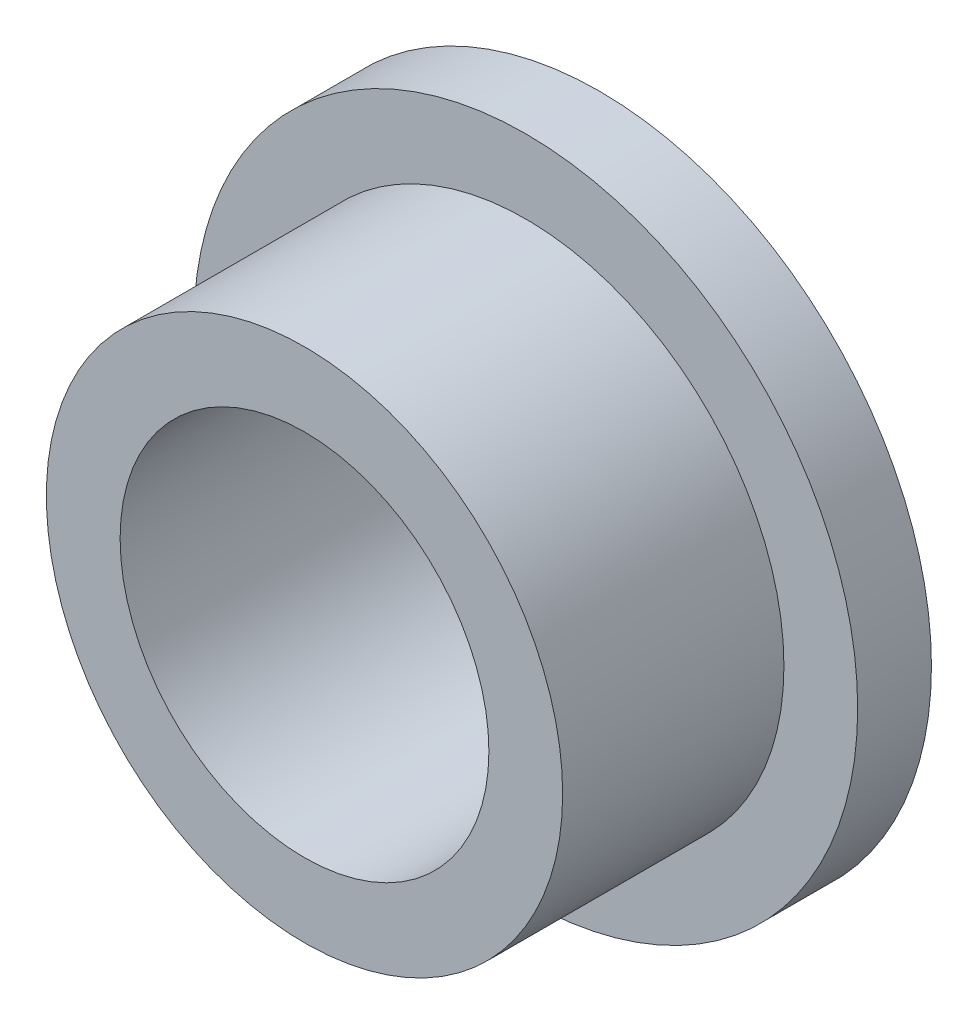
ISO-10303-21;
HEADER;
FILE_DESCRIPTION(('STEP AP214'),'2;1');
FILE_NAME('part.step','',(''),(''),'','','');
FILE_SCHEMA(('AUTOMOTIVE_DESIGN { 1 0 10303 214 1 1 1 1 }'));
ENDSEC;
DATA;
#1=APPLICATION_CONTEXT('core data for automotive mechanical design processes');
#2=APPLICATION_PROTOCOL_DEFINITION('international standard','automotive_design',2000,#1);
#3=PRODUCT_CONTEXT('',#1,'mechanical');
#4=PRODUCT('Part','Part','',(#3));
#5=PRODUCT_RELATED_PRODUCT_CATEGORY('part','',(#4));
#6=PRODUCT_DEFINITION_FORMATION('','',#4);
#7=PRODUCT_DEFINITION_CONTEXT('part definition',#1,'design');
#8=PRODUCT_DEFINITION('design','',#6,#7);
#9=PRODUCT_DEFINITION_SHAPE('','',#8);
#10=(LENGTH_UNIT() NAMED_UNIT(*) SI_UNIT(.MILLI.,.METRE.));
#11=(NAMED_UNIT(*) PLANE_ANGLE_UNIT() SI_UNIT($,.RADIAN.));
#12=(NAMED_UNIT(*) SI_UNIT($,.STERADIAN.) SOLID_ANGLE_UNIT());
#13=UNCERTAINTY_MEASURE_WITH_UNIT(LENGTH_MEASURE(1.E-05),#10,'distance_accuracy_value','');
#14=(GEOMETRIC_REPRESENTATION_CONTEXT(3) GLOBAL_UNCERTAINTY_ASSIGNED_CONTEXT((#13)) GLOBAL_UNIT_ASSIGNED_CONTEXT((#10,
#11,#12)) REPRESENTATION_CONTEXT('',''));
#15=CARTESIAN_POINT('',(0.,0.,0.));
#16=DIRECTION('',(0.,0.,1.));
#17=DIRECTION('',(1.,0.,0.));
#18=AXIS2_PLACEMENT_3D('',#15,#16,#17);
#19=CARTESIAN_POINT('',(0.,0.,6.35));
#20=DIRECTION('',(0.,0.,1.));
#21=DIRECTION('',(1.,0.,0.));
#22=AXIS2_PLACEMENT_3D('',#19,#20,#21);
#23=PLANE('',#22);
#24=CARTESIAN_POINT('',(0.,0.,6.35));
#25=DIRECTION('',(0.,0.,1.));
#26=DIRECTION('',(1.,0.,0.));
#27=AXIS2_PLACEMENT_3D('',#24,#25,#26);
#28=CIRCLE('',#27,3.96875);
#29=CARTESIAN_POINT('',(3.96875,0.,6.35));
#30=VERTEX_POINT('',#29);
#31=EDGE_CURVE('E37',#30,#30,#28,.T.);
#32=ORIENTED_EDGE('',*,*,#31,.F.);
#33=EDGE_LOOP('',(#32));
#34=FACE_BOUND('',#33,.T.);
#35=CARTESIAN_POINT('',(0.,0.,6.35));
#36=DIRECTION('',(0.,0.,1.));
#37=DIRECTION('',(1.,0.,0.));
#38=AXIS2_PLACEMENT_3D('',#35,#36,#37);
#39=CIRCLE('',#38,5.55625);
#40=CARTESIAN_POINT('',(5.55625,0.,6.35));
#41=VERTEX_POINT('',#40);
#42=EDGE_CURVE('E51',#41,#41,#39,.T.);
#43=ORIENTED_EDGE('',*,*,#42,.T.);
#44=EDGE_LOOP('',(#43));
#45=FACE_BOUND('',#44,.T.);
#46=ADVANCED_FACE('F30',(#34,#45),#23,.T.);
#47=CARTESIAN_POINT('',(0.,0.,6.35));
#48=DIRECTION('',(0.,0.,-1.));
#49=DIRECTION('',(-1.,0.,0.));
#50=AXIS2_PLACEMENT_3D('',#47,#48,#49);
#51=CYLINDRICAL_SURFACE('',#50,7.14375);
#52=CARTESIAN_POINT('',(0.,0.,0.));
#53=DIRECTION('',(0.,0.,1.));
#54=DIRECTION('',(1.,0.,0.));
#55=AXIS2_PLACEMENT_3D('',#52,#53,#54);
#56=CIRCLE('',#55,7.14375);
#57=CARTESIAN_POINT('',(7.14375,0.,0.));
#58=VERTEX_POINT('',#57);
#59=EDGE_CURVE('E10',#58,#58,#56,.T.);
#60=ORIENTED_EDGE('',*,*,#59,.T.);
#61=EDGE_LOOP('',(#60));
#62=FACE_BOUND('',#61,.T.);
#63=CARTESIAN_POINT('',(0.,0.,1.5875));
#64=DIRECTION('',(0.,0.,1.));
#65=DIRECTION('',(1.,0.,0.));
#66=AXIS2_PLACEMENT_3D('',#63,#64,#65);
#67=CIRCLE('',#66,7.14375);
#68=CARTESIAN_POINT('',(7.14375,0.,1.5875));
#69=VERTEX_POINT('',#68);
#70=EDGE_CURVE('E46',#69,#69,#67,.T.);
#71=ORIENTED_EDGE('',*,*,#70,.F.);
#72=EDGE_LOOP('',(#71));
#73=FACE_BOUND('',#72,.T.);
#74=ADVANCED_FACE('F32',(#62,#73),#51,.T.);
#75=CARTESIAN_POINT('',(0.,0.,0.));
#76=DIRECTION('',(0.,0.,1.));
#77=DIRECTION('',(1.,0.,0.));
#78=AXIS2_PLACEMENT_3D('',#75,#76,#77);
#79=PLANE('',#78);
#80=ORIENTED_EDGE('',*,*,#59,.F.);
#81=EDGE_LOOP('',(#80));
#82=FACE_BOUND('',#81,.T.);
#83=CARTESIAN_POINT('',(0.,0.,0.));
#84=DIRECTION('',(0.,0.,1.));
#85=DIRECTION('',(1.,0.,0.));
#86=AXIS2_PLACEMENT_3D('',#83,#84,#85);
#87=CIRCLE('',#86,3.96875);
#88=CARTESIAN_POINT('',(3.96875,0.,0.));
#89=VERTEX_POINT('',#88);
#90=EDGE_CURVE('E41',#89,#89,#87,.T.);
#91=ORIENTED_EDGE('',*,*,#90,.T.);
#92=EDGE_LOOP('',(#91));
#93=FACE_BOUND('',#92,.T.);
#94=ADVANCED_FACE('F68',(#82,#93),#79,.F.);
#95=CARTESIAN_POINT('',(0.,0.,6.35));
#96=DIRECTION('',(0.,0.,-1.));
#97=DIRECTION('',(-1.,0.,0.));
#98=AXIS2_PLACEMENT_3D('',#95,#96,#97);
#99=CYLINDRICAL_SURFACE('',#98,3.96875);
#100=ORIENTED_EDGE('',*,*,#31,.T.);
#101=EDGE_LOOP('',(#100));
#102=FACE_BOUND('',#101,.T.);
#103=ORIENTED_EDGE('',*,*,#90,.F.);
#104=EDGE_LOOP('',(#103));
#105=FACE_BOUND('',#104,.T.);
#106=ADVANCED_FACE('F63',(#102,#105),#99,.F.);
#107=CARTESIAN_POINT('',(0.,0.,1.5875));
#108=DIRECTION('',(0.,0.,1.));
#109=DIRECTION('',(1.,0.,0.));
#110=AXIS2_PLACEMENT_3D('',#107,#108,#109);
#111=PLANE('',#110);
#112=CARTESIAN_POINT('',(0.,0.,1.5875));
#113=DIRECTION('',(0.,0.,1.));
#114=DIRECTION('',(1.,0.,0.));
#115=AXIS2_PLACEMENT_3D('',#112,#113,#114);
#116=CIRCLE('',#115,5.55625);
#117=CARTESIAN_POINT('',(5.55625,0.,1.5875));
#118=VERTEX_POINT('',#117);
#119=EDGE_CURVE('E50',#118,#118,#116,.T.);
#120=ORIENTED_EDGE('',*,*,#119,.F.);
#121=EDGE_LOOP('',(#120));
#122=FACE_BOUND('',#121,.T.);
#123=ORIENTED_EDGE('',*,*,#70,.T.);
#124=EDGE_LOOP('',(#123));
#125=FACE_BOUND('',#124,.T.);
#126=ADVANCED_FACE('F60',(#122,#125),#111,.T.);
#127=CARTESIAN_POINT('',(0.,0.,1.5875));
#128=DIRECTION('',(0.,0.,1.));
#129=DIRECTION('',(1.,0.,0.));
#130=AXIS2_PLACEMENT_3D('',#127,#128,#129);
#131=CYLINDRICAL_SURFACE('',#130,5.55625);
#132=CARTESIAN_POINT('',(5.55625,0.,1.5875));
#133=CARTESIAN_POINT('',(5.55625,0.,1.637109375));
#134=CARTESIAN_POINT('',(5.55625,0.,1.68671875));
#135=CARTESIAN_POINT('',(5.55625,0.,1.7859375));
#136=CARTESIAN_POINT('',(5.55625,0.,1.835546875));
#137=CARTESIAN_POINT('',(5.55625,0.,1.934765625));
#138=CARTESIAN_POINT('',(5.55625,0.,1.984375));
#139=CARTESIAN_POINT('',(5.55625,0.,2.08359375));
#140=CARTESIAN_POINT('',(5.55625,0.,2.133203125));
#141=CARTESIAN_POINT('',(5.55625,0.,2.232421875));
#142=CARTESIAN_POINT('',(5.55625,0.,2.28203125));
#143=CARTESIAN_POINT('',(5.55625,0.,2.38125));
#144=CARTESIAN_POINT('',(5.55625,0.,2.430859375));
#145=CARTESIAN_POINT('',(5.55625,0.,2.530078125));
#146=CARTESIAN_POINT('',(5.55625,0.,2.5796875));
#147=CARTESIAN_POINT('',(5.55625,0.,2.67890625));
#148=CARTESIAN_POINT('',(5.55625,0.,2.728515625));
#149=CARTESIAN_POINT('',(5.55625,0.,2.827734375));
#150=CARTESIAN_POINT('',(5.55625,0.,2.87734375));
#151=CARTESIAN_POINT('',(5.55625,0.,2.9765625));
#152=CARTESIAN_POINT('',(5.55625,0.,3.026171875));
#153=CARTESIAN_POINT('',(5.55625,0.,3.125390625));
#154=CARTESIAN_POINT('',(5.55625,0.,3.175));
#155=CARTESIAN_POINT('',(5.55625,0.,3.27421875));
#156=CARTESIAN_POINT('',(5.55625,0.,3.323828125));
#157=CARTESIAN_POINT('',(5.55625,0.,3.423046875));
#158=CARTESIAN_POINT('',(5.55625,0.,3.47265625));
#159=CARTESIAN_POINT('',(5.55625,0.,3.571875));
#160=CARTESIAN_POINT('',(5.55625,0.,3.621484375));
#161=CARTESIAN_POINT('',(5.55625,0.,3.720703125));
#162=CARTESIAN_POINT('',(5.55625,0.,3.7703125));
#163=CARTESIAN_POINT('',(5.55625,0.,3.86953125));
#164=CARTESIAN_POINT('',(5.55625,0.,3.919140625));
#165=CARTESIAN_POINT('',(5.55625,0.,4.018359375));
#166=CARTESIAN_POINT('',(5.55625,0.,4.06796875));
#167=CARTESIAN_POINT('',(5.55625,0.,4.1671875));
#168=CARTESIAN_POINT('',(5.55625,0.,4.216796875));
#169=CARTESIAN_POINT('',(5.55625,0.,4.316015625));
#170=CARTESIAN_POINT('',(5.55625,0.,4.365625));
#171=CARTESIAN_POINT('',(5.55625,0.,4.46484375));
#172=CARTESIAN_POINT('',(5.55625,0.,4.514453125));
#173=CARTESIAN_POINT('',(5.55625,0.,4.613671875));
#174=CARTESIAN_POINT('',(5.55625,0.,4.66328125));
#175=CARTESIAN_POINT('',(5.55625,0.,4.7625));
#176=CARTESIAN_POINT('',(5.55625,0.,4.812109375));
#177=CARTESIAN_POINT('',(5.55625,0.,4.911328125));
#178=CARTESIAN_POINT('',(5.55625,0.,4.9609375));
#179=CARTESIAN_POINT('',(5.55625,0.,5.06015625));
#180=CARTESIAN_POINT('',(5.55625,0.,5.109765625));
#181=CARTESIAN_POINT('',(5.55625,0.,5.208984375));
#182=CARTESIAN_POINT('',(5.55625,0.,5.25859375));
#183=CARTESIAN_POINT('',(5.55625,0.,5.3578125));
#184=CARTESIAN_POINT('',(5.55625,0.,5.407421875));
#185=CARTESIAN_POINT('',(5.55625,0.,5.506640625));
#186=CARTESIAN_POINT('',(5.55625,0.,5.55625));
#187=CARTESIAN_POINT('',(5.55625,0.,5.65546875));
#188=CARTESIAN_POINT('',(5.55625,0.,5.705078125));
#189=CARTESIAN_POINT('',(5.55625,0.,5.804296875));
#190=CARTESIAN_POINT('',(5.55625,0.,5.85390625));
#191=CARTESIAN_POINT('',(5.55625,0.,5.953125));
#192=CARTESIAN_POINT('',(5.55625,0.,6.002734375));
#193=CARTESIAN_POINT('',(5.55625,0.,6.101953125));
#194=CARTESIAN_POINT('',(5.55625,0.,6.1515625));
#195=CARTESIAN_POINT('',(5.55625,0.,6.25078125));
#196=CARTESIAN_POINT('',(5.55625,0.,6.300390625));
#197=CARTESIAN_POINT('',(5.55625,0.,6.35));
#198=B_SPLINE_CURVE_WITH_KNOTS('',3,(#132,#133,#134,#135,#136,#137,#138,#139,#140,#141,#142,
#143,#144,#145,#146,#147,#148,#149,#150,#151,#152,#153,#154,#155,#156,#157,#158,#159,#160,#161,
#162,#163,#164,#165,#166,#167,#168,#169,#170,#171,#172,#173,#174,#175,#176,#177,#178,#179,#180,
#181,#182,#183,#184,#185,#186,#187,#188,#189,#190,#191,#192,#193,#194,#195,#196,#197),
.UNSPECIFIED.,.F.,.F.,(4,2,2,2,2,2,2,2,2,2,2,2,2,2,2,2,2,2,2,2,2,2,2,2,2,2,2,2,2,2,2,2,4),(0.,
0.148828125,0.29765625,0.446484375,0.5953125,0.744140625,0.89296875,1.041796875,1.190625,
1.339453125,1.48828125,1.637109375,1.7859375,1.934765625,2.08359375,2.232421875,2.38125,
2.530078125,2.67890625,2.827734375,2.9765625,3.125390625,3.27421875,3.423046875,3.571875,
3.720703125,3.86953125,4.018359375,4.1671875,4.316015625,4.46484375,4.613671875,4.7625),.UNSPECIFIED.);
#199=EDGE_CURVE('BSEAM57',#118,#41,#198,.T.);
#200=ORIENTED_EDGE('',*,*,#119,.T.);
#201=ORIENTED_EDGE('',*,*,#42,.F.);
#202=ORIENTED_EDGE('',*,*,#199,.T.);
#203=ORIENTED_EDGE('',*,*,#199,.F.);
#204=EDGE_LOOP('',(#200,#202,#201,#203));
#205=FACE_BOUND('',#204,.T.);
#206=ADVANCED_FACE('F57',(#205),#131,.T.);
#207=CLOSED_SHELL('',(#46,#74,#94,#106,#126,#206));
#208=MANIFOLD_SOLID_BREP('B2',#207);
#209=ADVANCED_BREP_SHAPE_REPRESENTATION('',(#18,#208),#14);
#210=SHAPE_DEFINITION_REPRESENTATION(#9,#209);
ENDSEC;
END-ISO-10303-21;
